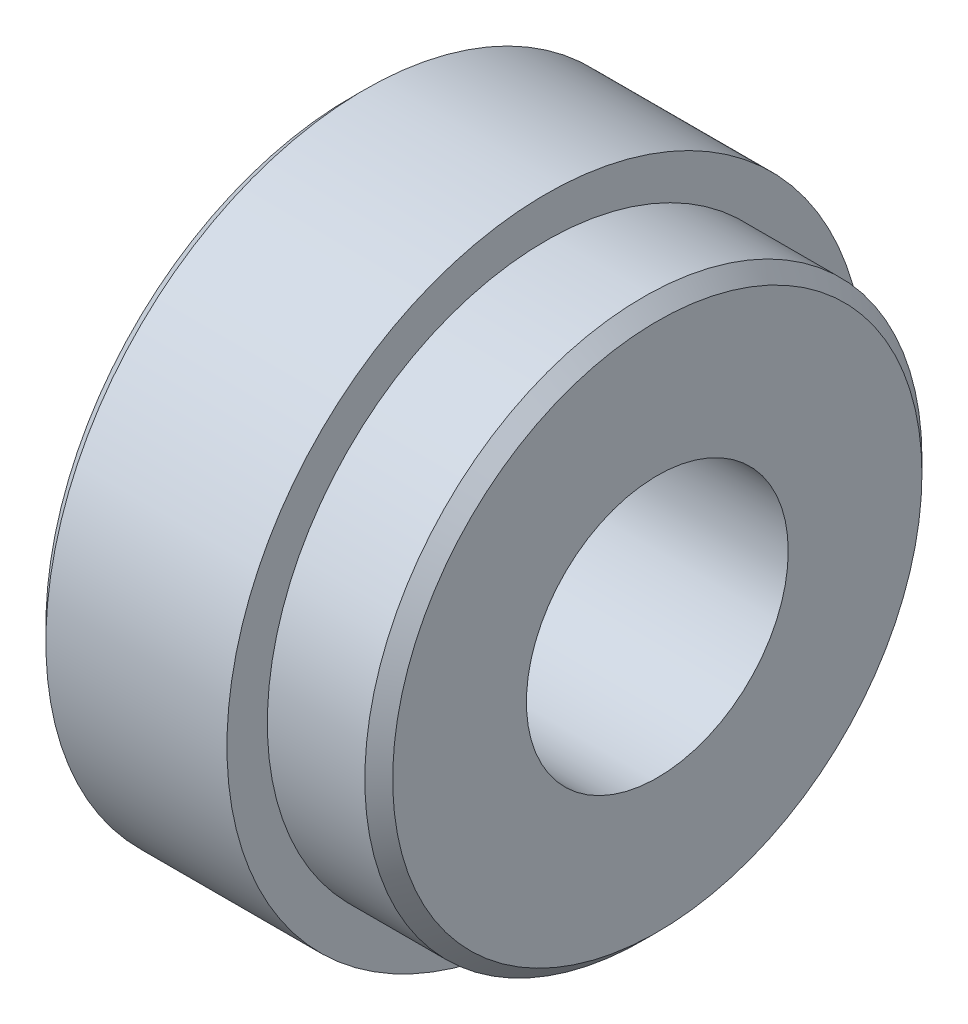
ISO-10303-21;
HEADER;
FILE_DESCRIPTION(('STEP AP214'),'2;1');
FILE_NAME('part.step','',(''),(''),'','','');
FILE_SCHEMA(('AUTOMOTIVE_DESIGN { 1 0 10303 214 1 1 1 1 }'));
ENDSEC;
DATA;
#1=APPLICATION_CONTEXT('core data for automotive mechanical design processes');
#2=APPLICATION_PROTOCOL_DEFINITION('international standard','automotive_design',2000,#1);
#3=PRODUCT_CONTEXT('',#1,'mechanical');
#4=PRODUCT('Part','Part','',(#3));
#5=PRODUCT_RELATED_PRODUCT_CATEGORY('part','',(#4));
#6=PRODUCT_DEFINITION_FORMATION('','',#4);
#7=PRODUCT_DEFINITION_CONTEXT('part definition',#1,'design');
#8=PRODUCT_DEFINITION('design','',#6,#7);
#9=PRODUCT_DEFINITION_SHAPE('','',#8);
#10=(LENGTH_UNIT() NAMED_UNIT(*) SI_UNIT(.MILLI.,.METRE.));
#11=(NAMED_UNIT(*) PLANE_ANGLE_UNIT() SI_UNIT($,.RADIAN.));
#12=(NAMED_UNIT(*) SI_UNIT($,.STERADIAN.) SOLID_ANGLE_UNIT());
#13=UNCERTAINTY_MEASURE_WITH_UNIT(LENGTH_MEASURE(1.E-05),#10,'distance_accuracy_value','');
#14=(GEOMETRIC_REPRESENTATION_CONTEXT(3) GLOBAL_UNCERTAINTY_ASSIGNED_CONTEXT((#13)) GLOBAL_UNIT_ASSIGNED_CONTEXT((#10,
#11,#12)) REPRESENTATION_CONTEXT('',''));
#15=CARTESIAN_POINT('',(0.,0.,0.));
#16=DIRECTION('',(0.,0.,1.));
#17=DIRECTION('',(1.,0.,0.));
#18=AXIS2_PLACEMENT_3D('',#15,#16,#17);
#19=CARTESIAN_POINT('',(7.,0.,0.));
#20=DIRECTION('',(-1.,0.,0.));
#21=DIRECTION('',(0.,0.,1.));
#22=AXIS2_PLACEMENT_3D('',#19,#20,#21);
#23=CYLINDRICAL_SURFACE('',#22,11.45);
#24=CARTESIAN_POINT('',(0.500000000000007,0.,0.));
#25=DIRECTION('',(1.,0.,0.));
#26=DIRECTION('',(0.,0.,-1.));
#27=AXIS2_PLACEMENT_3D('',#24,#25,#26);
#28=CIRCLE('',#27,11.45);
#29=CARTESIAN_POINT('',(0.500000000000007,0.,-11.45));
#30=VERTEX_POINT('',#29);
#31=EDGE_CURVE('E58',#30,#30,#28,.T.);
#32=ORIENTED_EDGE('',*,*,#31,.T.);
#33=EDGE_LOOP('',(#32));
#34=FACE_BOUND('',#33,.T.);
#35=CARTESIAN_POINT('',(7.,0.,0.));
#36=DIRECTION('',(1.,0.,0.));
#37=DIRECTION('',(0.,0.,-1.));
#38=AXIS2_PLACEMENT_3D('',#35,#36,#37);
#39=CIRCLE('',#38,11.45);
#40=CARTESIAN_POINT('',(7.,0.,-11.45));
#41=VERTEX_POINT('',#40);
#42=EDGE_CURVE('E62',#41,#41,#39,.T.);
#43=ORIENTED_EDGE('',*,*,#42,.F.);
#44=EDGE_LOOP('',(#43));
#45=FACE_BOUND('',#44,.T.);
#46=ADVANCED_FACE('F34',(#34,#45),#23,.T.);
#47=CARTESIAN_POINT('',(7.,0.,0.));
#48=DIRECTION('',(1.,0.,0.));
#49=DIRECTION('',(0.,0.,-1.));
#50=AXIS2_PLACEMENT_3D('',#47,#48,#49);
#51=PLANE('',#50);
#52=CARTESIAN_POINT('',(7.,0.,0.));
#53=DIRECTION('',(1.,0.,0.));
#54=DIRECTION('',(0.,0.,-1.));
#55=AXIS2_PLACEMENT_3D('',#52,#53,#54);
#56=CIRCLE('',#55,10.);
#57=CARTESIAN_POINT('',(7.,0.,-10.));
#58=VERTEX_POINT('',#57);
#59=EDGE_CURVE('E61',#58,#58,#56,.T.);
#60=ORIENTED_EDGE('',*,*,#59,.F.);
#61=EDGE_LOOP('',(#60));
#62=FACE_BOUND('',#61,.T.);
#63=ORIENTED_EDGE('',*,*,#42,.T.);
#64=EDGE_LOOP('',(#63));
#65=FACE_BOUND('',#64,.T.);
#66=ADVANCED_FACE('F87',(#62,#65),#51,.T.);
#67=CARTESIAN_POINT('',(0.,0.,0.));
#68=DIRECTION('',(1.,0.,0.));
#69=DIRECTION('',(0.,0.,-1.));
#70=AXIS2_PLACEMENT_3D('',#67,#68,#69);
#71=PLANE('',#70);
#72=CARTESIAN_POINT('',(0.,0.,0.));
#73=DIRECTION('',(1.,0.,0.));
#74=DIRECTION('',(0.,0.,-1.));
#75=AXIS2_PLACEMENT_3D('',#72,#73,#74);
#76=CIRCLE('',#75,10.95);
#77=CARTESIAN_POINT('',(0.,0.,-10.95));
#78=VERTEX_POINT('',#77);
#79=EDGE_CURVE('E50',#78,#78,#76,.F.);
#80=ORIENTED_EDGE('',*,*,#79,.T.);
#81=EDGE_LOOP('',(#80));
#82=FACE_BOUND('',#81,.T.);
#83=CARTESIAN_POINT('',(0.,0.,0.));
#84=DIRECTION('',(1.,0.,0.));
#85=DIRECTION('',(0.,0.,-1.));
#86=AXIS2_PLACEMENT_3D('',#83,#84,#85);
#87=CIRCLE('',#86,5.20000000000001);
#88=CARTESIAN_POINT('',(0.,0.,-5.20000000000001));
#89=VERTEX_POINT('',#88);
#90=EDGE_CURVE('E55',#89,#89,#87,.T.);
#91=ORIENTED_EDGE('',*,*,#90,.T.);
#92=EDGE_LOOP('',(#91));
#93=FACE_BOUND('',#92,.T.);
#94=ADVANCED_FACE('F84',(#82,#93),#71,.F.);
#95=CARTESIAN_POINT('',(11.,0.,0.));
#96=DIRECTION('',(-1.,0.,0.));
#97=DIRECTION('',(0.,0.,1.));
#98=AXIS2_PLACEMENT_3D('',#95,#96,#97);
#99=CYLINDRICAL_SURFACE('',#98,10.);
#100=CARTESIAN_POINT('',(10.5,0.,0.));
#101=DIRECTION('',(1.,0.,0.));
#102=DIRECTION('',(0.,0.,-1.));
#103=AXIS2_PLACEMENT_3D('',#100,#101,#102);
#104=CIRCLE('',#103,10.);
#105=CARTESIAN_POINT('',(10.5,0.,-10.));
#106=VERTEX_POINT('',#105);
#107=EDGE_CURVE('E10',#106,#106,#104,.F.);
#108=ORIENTED_EDGE('',*,*,#107,.T.);
#109=EDGE_LOOP('',(#108));
#110=FACE_BOUND('',#109,.T.);
#111=ORIENTED_EDGE('',*,*,#59,.T.);
#112=EDGE_LOOP('',(#111));
#113=FACE_BOUND('',#112,.T.);
#114=ADVANCED_FACE('F75',(#110,#113),#99,.T.);
#115=CARTESIAN_POINT('',(11.,0.,0.));
#116=DIRECTION('',(1.,0.,0.));
#117=DIRECTION('',(0.,0.,-1.));
#118=AXIS2_PLACEMENT_3D('',#115,#116,#117);
#119=PLANE('',#118);
#120=CARTESIAN_POINT('',(11.,0.,0.));
#121=DIRECTION('',(1.,0.,0.));
#122=DIRECTION('',(0.,0.,-1.));
#123=AXIS2_PLACEMENT_3D('',#120,#121,#122);
#124=CIRCLE('',#123,9.5);
#125=CARTESIAN_POINT('',(11.,0.,-9.5));
#126=VERTEX_POINT('',#125);
#127=EDGE_CURVE('E42',#126,#126,#124,.T.);
#128=ORIENTED_EDGE('',*,*,#127,.T.);
#129=EDGE_LOOP('',(#128));
#130=FACE_BOUND('',#129,.T.);
#131=CARTESIAN_POINT('',(11.,0.,0.));
#132=DIRECTION('',(1.,0.,0.));
#133=DIRECTION('',(0.,0.,-1.));
#134=AXIS2_PLACEMENT_3D('',#131,#132,#133);
#135=CIRCLE('',#134,4.7);
#136=CARTESIAN_POINT('',(11.,0.,-4.7));
#137=VERTEX_POINT('',#136);
#138=EDGE_CURVE('E65',#137,#137,#135,.T.);
#139=ORIENTED_EDGE('',*,*,#138,.F.);
#140=EDGE_LOOP('',(#139));
#141=FACE_BOUND('',#140,.T.);
#142=ADVANCED_FACE('F73',(#130,#141),#119,.T.);
#143=CARTESIAN_POINT('',(0.,0.,0.));
#144=DIRECTION('',(1.,0.,0.));
#145=DIRECTION('',(0.,0.,-1.));
#146=AXIS2_PLACEMENT_3D('',#143,#144,#145);
#147=CYLINDRICAL_SURFACE('',#146,4.7);
#148=CARTESIAN_POINT('',(0.500000000000004,0.,0.));
#149=DIRECTION('',(1.,0.,0.));
#150=DIRECTION('',(0.,0.,-1.));
#151=AXIS2_PLACEMENT_3D('',#148,#149,#150);
#152=CIRCLE('',#151,4.7);
#153=CARTESIAN_POINT('',(0.500000000000004,0.,-4.7));
#154=VERTEX_POINT('',#153);
#155=EDGE_CURVE('E46',#154,#154,#152,.F.);
#156=ORIENTED_EDGE('',*,*,#155,.T.);
#157=EDGE_LOOP('',(#156));
#158=FACE_BOUND('',#157,.T.);
#159=ORIENTED_EDGE('',*,*,#138,.T.);
#160=EDGE_LOOP('',(#159));
#161=FACE_BOUND('',#160,.T.);
#162=ADVANCED_FACE('F71',(#158,#161),#147,.F.);
#163=CARTESIAN_POINT('',(0.500000000000007,0.,0.));
#164=DIRECTION('',(1.,0.,0.));
#165=DIRECTION('',(0.,0.,-1.));
#166=AXIS2_PLACEMENT_3D('',#163,#164,#165);
#167=CONICAL_SURFACE('',#166,11.45,0.78539816339745);
#168=ORIENTED_EDGE('',*,*,#79,.F.);
#169=EDGE_LOOP('',(#168));
#170=FACE_BOUND('',#169,.T.);
#171=ORIENTED_EDGE('',*,*,#31,.F.);
#172=EDGE_LOOP('',(#171));
#173=FACE_BOUND('',#172,.T.);
#174=ADVANCED_FACE('F81',(#170,#173),#167,.T.);
#175=CARTESIAN_POINT('',(0.,0.,0.));
#176=DIRECTION('',(-1.,0.,0.));
#177=DIRECTION('',(0.,0.,1.));
#178=AXIS2_PLACEMENT_3D('',#175,#176,#177);
#179=CONICAL_SURFACE('',#178,5.20000000000001,0.785398163397451);
#180=ORIENTED_EDGE('',*,*,#155,.F.);
#181=EDGE_LOOP('',(#180));
#182=FACE_BOUND('',#181,.T.);
#183=ORIENTED_EDGE('',*,*,#90,.F.);
#184=EDGE_LOOP('',(#183));
#185=FACE_BOUND('',#184,.T.);
#186=ADVANCED_FACE('F103',(#182,#185),#179,.F.);
#187=CARTESIAN_POINT('',(11.,0.,0.));
#188=DIRECTION('',(-1.,0.,0.));
#189=DIRECTION('',(0.,0.,1.));
#190=AXIS2_PLACEMENT_3D('',#187,#188,#189);
#191=CONICAL_SURFACE('',#190,9.5,0.785398163397448);
#192=ORIENTED_EDGE('',*,*,#107,.F.);
#193=EDGE_LOOP('',(#192));
#194=FACE_BOUND('',#193,.T.);
#195=ORIENTED_EDGE('',*,*,#127,.F.);
#196=EDGE_LOOP('',(#195));
#197=FACE_BOUND('',#196,.T.);
#198=ADVANCED_FACE('F37',(#194,#197),#191,.T.);
#199=CLOSED_SHELL('',(#46,#66,#94,#114,#142,#162,#174,#186,#198));
#200=MANIFOLD_SOLID_BREP('B2',#199);
#201=ADVANCED_BREP_SHAPE_REPRESENTATION('',(#18,#200),#14);
#202=SHAPE_DEFINITION_REPRESENTATION(#9,#201);
ENDSEC;
END-ISO-10303-21;
